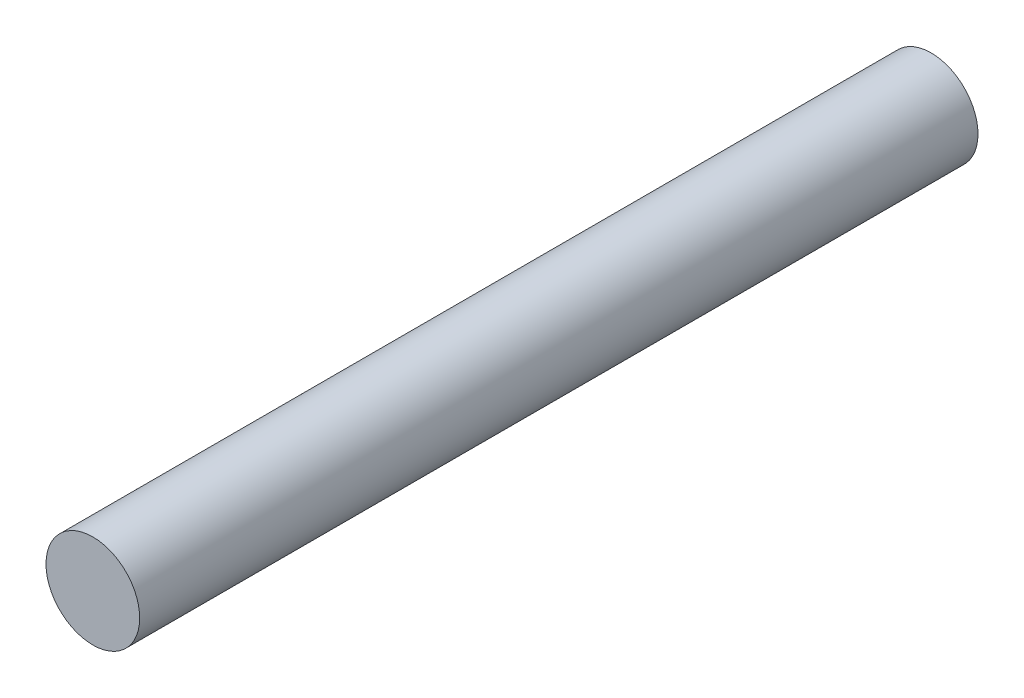
ISO-10303-21;
HEADER;
FILE_DESCRIPTION(('STEP AP214'),'2;1');
FILE_NAME('part.step','',(''),(''),'','','');
FILE_SCHEMA(('AUTOMOTIVE_DESIGN { 1 0 10303 214 1 1 1 1 }'));
ENDSEC;
DATA;
#1=APPLICATION_CONTEXT('core data for automotive mechanical design processes');
#2=APPLICATION_PROTOCOL_DEFINITION('international standard','automotive_design',2000,#1);
#3=PRODUCT_CONTEXT('',#1,'mechanical');
#4=PRODUCT('Part','Part','',(#3));
#5=PRODUCT_RELATED_PRODUCT_CATEGORY('part','',(#4));
#6=PRODUCT_DEFINITION_FORMATION('','',#4);
#7=PRODUCT_DEFINITION_CONTEXT('part definition',#1,'design');
#8=PRODUCT_DEFINITION('design','',#6,#7);
#9=PRODUCT_DEFINITION_SHAPE('','',#8);
#10=(LENGTH_UNIT() NAMED_UNIT(*) SI_UNIT(.MILLI.,.METRE.));
#11=(NAMED_UNIT(*) PLANE_ANGLE_UNIT() SI_UNIT($,.RADIAN.));
#12=(NAMED_UNIT(*) SI_UNIT($,.STERADIAN.) SOLID_ANGLE_UNIT());
#13=UNCERTAINTY_MEASURE_WITH_UNIT(LENGTH_MEASURE(1.E-05),#10,'distance_accuracy_value','');
#14=(GEOMETRIC_REPRESENTATION_CONTEXT(3) GLOBAL_UNCERTAINTY_ASSIGNED_CONTEXT((#13)) GLOBAL_UNIT_ASSIGNED_CONTEXT((#10,
#11,#12)) REPRESENTATION_CONTEXT('',''));
#15=CARTESIAN_POINT('',(0.,0.,0.));
#16=DIRECTION('',(0.,0.,1.));
#17=DIRECTION('',(1.,0.,0.));
#18=AXIS2_PLACEMENT_3D('',#15,#16,#17);
#19=CARTESIAN_POINT('',(0.,0.,14.3200034916197));
#20=DIRECTION('',(0.,0.,1.));
#21=DIRECTION('',(1.,0.,0.));
#22=AXIS2_PLACEMENT_3D('',#19,#20,#21);
#23=PLANE('',#22);
#24=CARTESIAN_POINT('',(0.,0.,14.3200034916197));
#25=DIRECTION('',(0.,0.,-1.));
#26=DIRECTION('',(-1.,0.,0.));
#27=AXIS2_PLACEMENT_3D('',#24,#25,#26);
#28=CIRCLE('',#27,1.6);
#29=CARTESIAN_POINT('',(-1.6,0.,14.3200034916197));
#30=VERTEX_POINT('',#29);
#31=EDGE_CURVE('E9',#30,#30,#28,.T.);
#32=ORIENTED_EDGE('',*,*,#31,.F.);
#33=EDGE_LOOP('',(#32));
#34=FACE_BOUND('',#33,.T.);
#35=ADVANCED_FACE('F14',(#34),#23,.T.);
#36=CARTESIAN_POINT('',(0.,0.,-14.3200034916197));
#37=DIRECTION('',(0.,0.,-1.));
#38=DIRECTION('',(-1.,0.,0.));
#39=AXIS2_PLACEMENT_3D('',#36,#37,#38);
#40=PLANE('',#39);
#41=CARTESIAN_POINT('',(0.,0.,-14.3200034916197));
#42=DIRECTION('',(0.,0.,1.));
#43=DIRECTION('',(1.,0.,0.));
#44=AXIS2_PLACEMENT_3D('',#41,#42,#43);
#45=CIRCLE('',#44,1.6);
#46=CARTESIAN_POINT('',(1.6,0.,-14.3200034916197));
#47=VERTEX_POINT('',#46);
#48=EDGE_CURVE('E21',#47,#47,#45,.T.);
#49=ORIENTED_EDGE('',*,*,#48,.F.);
#50=EDGE_LOOP('',(#49));
#51=FACE_BOUND('',#50,.T.);
#52=ADVANCED_FACE('F29',(#51),#40,.T.);
#53=CARTESIAN_POINT('',(0.,0.,-14.3200034916197));
#54=DIRECTION('',(0.,0.,1.));
#55=DIRECTION('',(1.,0.,0.));
#56=AXIS2_PLACEMENT_3D('',#53,#54,#55);
#57=CYLINDRICAL_SURFACE('',#56,1.6);
#58=ORIENTED_EDGE('',*,*,#31,.T.);
#59=EDGE_LOOP('',(#58));
#60=FACE_BOUND('',#59,.T.);
#61=ORIENTED_EDGE('',*,*,#48,.T.);
#62=EDGE_LOOP('',(#61));
#63=FACE_BOUND('',#62,.T.);
#64=ADVANCED_FACE('F16',(#60,#63),#57,.T.);
#65=CLOSED_SHELL('',(#35,#52,#64));
#66=MANIFOLD_SOLID_BREP('B1',#65);
#67=ADVANCED_BREP_SHAPE_REPRESENTATION('',(#18,#66),#14);
#68=SHAPE_DEFINITION_REPRESENTATION(#9,#67);
ENDSEC;
END-ISO-10303-21;
